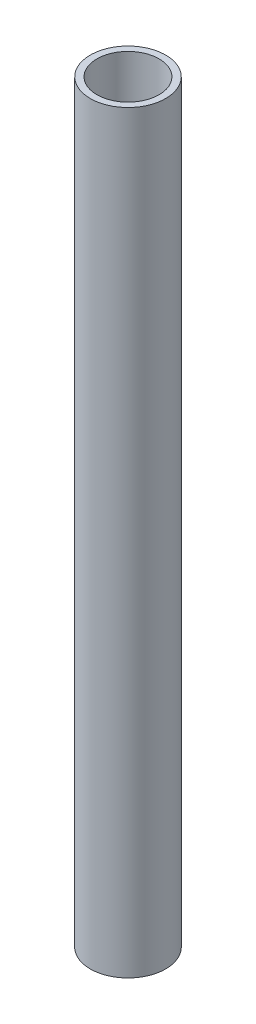
ISO-10303-21;
HEADER;
FILE_DESCRIPTION(('STEP AP214'),'2;1');
FILE_NAME('part.step','',(''),(''),'','','');
FILE_SCHEMA(('AUTOMOTIVE_DESIGN { 1 0 10303 214 1 1 1 1 }'));
ENDSEC;
DATA;
#1=APPLICATION_CONTEXT('core data for automotive mechanical design processes');
#2=APPLICATION_PROTOCOL_DEFINITION('international standard','automotive_design',2000,#1);
#3=PRODUCT_CONTEXT('',#1,'mechanical');
#4=PRODUCT('Part','Part','',(#3));
#5=PRODUCT_RELATED_PRODUCT_CATEGORY('part','',(#4));
#6=PRODUCT_DEFINITION_FORMATION('','',#4);
#7=PRODUCT_DEFINITION_CONTEXT('part definition',#1,'design');
#8=PRODUCT_DEFINITION('design','',#6,#7);
#9=PRODUCT_DEFINITION_SHAPE('','',#8);
#10=(LENGTH_UNIT() NAMED_UNIT(*) SI_UNIT(.MILLI.,.METRE.));
#11=(NAMED_UNIT(*) PLANE_ANGLE_UNIT() SI_UNIT($,.RADIAN.));
#12=(NAMED_UNIT(*) SI_UNIT($,.STERADIAN.) SOLID_ANGLE_UNIT());
#13=UNCERTAINTY_MEASURE_WITH_UNIT(LENGTH_MEASURE(1.E-05),#10,'distance_accuracy_value','');
#14=(GEOMETRIC_REPRESENTATION_CONTEXT(3) GLOBAL_UNCERTAINTY_ASSIGNED_CONTEXT((#13)) GLOBAL_UNIT_ASSIGNED_CONTEXT((#10,
#11,#12)) REPRESENTATION_CONTEXT('',''));
#15=CARTESIAN_POINT('',(0.,0.,0.));
#16=DIRECTION('',(0.,0.,1.));
#17=DIRECTION('',(1.,0.,0.));
#18=AXIS2_PLACEMENT_3D('',#15,#16,#17);
#19=CARTESIAN_POINT('',(0.,20.,0.));
#20=DIRECTION('',(0.,-1.,0.));
#21=DIRECTION('',(0.,0.,-1.));
#22=AXIS2_PLACEMENT_3D('',#19,#20,#21);
#23=CYLINDRICAL_SURFACE('',#22,2.);
#24=CARTESIAN_POINT('',(0.,20.,0.));
#25=DIRECTION('',(0.,1.,0.));
#26=DIRECTION('',(0.,0.,1.));
#27=AXIS2_PLACEMENT_3D('',#24,#25,#26);
#28=CIRCLE('',#27,2.);
#29=CARTESIAN_POINT('',(0.,20.,2.));
#30=VERTEX_POINT('',#29);
#31=EDGE_CURVE('E10',#30,#30,#28,.T.);
#32=ORIENTED_EDGE('',*,*,#31,.F.);
#33=EDGE_LOOP('',(#32));
#34=FACE_BOUND('',#33,.T.);
#35=CARTESIAN_POINT('',(0.,-20.,0.));
#36=DIRECTION('',(0.,1.,0.));
#37=DIRECTION('',(0.,0.,1.));
#38=AXIS2_PLACEMENT_3D('',#35,#36,#37);
#39=CIRCLE('',#38,2.);
#40=CARTESIAN_POINT('',(0.,-20.,2.));
#41=VERTEX_POINT('',#40);
#42=EDGE_CURVE('E36',#41,#41,#39,.T.);
#43=ORIENTED_EDGE('',*,*,#42,.T.);
#44=EDGE_LOOP('',(#43));
#45=FACE_BOUND('',#44,.T.);
#46=ADVANCED_FACE('F33',(#34,#45),#23,.T.);
#47=CARTESIAN_POINT('',(0.,20.,0.));
#48=DIRECTION('',(0.,1.,0.));
#49=DIRECTION('',(0.,0.,1.));
#50=AXIS2_PLACEMENT_3D('',#47,#48,#49);
#51=PLANE('',#50);
#52=CARTESIAN_POINT('',(0.,20.,0.));
#53=DIRECTION('',(0.,1.,0.));
#54=DIRECTION('',(0.,0.,1.));
#55=AXIS2_PLACEMENT_3D('',#52,#53,#54);
#56=CIRCLE('',#55,1.65);
#57=CARTESIAN_POINT('',(0.,20.,1.65));
#58=VERTEX_POINT('',#57);
#59=EDGE_CURVE('E43',#58,#58,#56,.T.);
#60=ORIENTED_EDGE('',*,*,#59,.F.);
#61=EDGE_LOOP('',(#60));
#62=FACE_BOUND('',#61,.T.);
#63=ORIENTED_EDGE('',*,*,#31,.T.);
#64=EDGE_LOOP('',(#63));
#65=FACE_BOUND('',#64,.T.);
#66=ADVANCED_FACE('F61',(#62,#65),#51,.T.);
#67=CARTESIAN_POINT('',(0.,-20.,0.));
#68=DIRECTION('',(0.,1.,0.));
#69=DIRECTION('',(0.,0.,1.));
#70=AXIS2_PLACEMENT_3D('',#67,#68,#69);
#71=PLANE('',#70);
#72=CARTESIAN_POINT('',(0.,-20.,0.));
#73=DIRECTION('',(0.,1.,0.));
#74=DIRECTION('',(0.,0.,1.));
#75=AXIS2_PLACEMENT_3D('',#72,#73,#74);
#76=CIRCLE('',#75,1.65);
#77=CARTESIAN_POINT('',(0.,-20.,1.65));
#78=VERTEX_POINT('',#77);
#79=EDGE_CURVE('E47',#78,#78,#76,.T.);
#80=ORIENTED_EDGE('',*,*,#79,.T.);
#81=EDGE_LOOP('',(#80));
#82=FACE_BOUND('',#81,.T.);
#83=ORIENTED_EDGE('',*,*,#42,.F.);
#84=EDGE_LOOP('',(#83));
#85=FACE_BOUND('',#84,.T.);
#86=ADVANCED_FACE('F51',(#82,#85),#71,.F.);
#87=CARTESIAN_POINT('',(0.,-20.,0.));
#88=DIRECTION('',(0.,1.,0.));
#89=DIRECTION('',(0.,0.,1.));
#90=AXIS2_PLACEMENT_3D('',#87,#88,#89);
#91=CYLINDRICAL_SURFACE('',#90,1.65);
#92=ORIENTED_EDGE('',*,*,#59,.T.);
#93=EDGE_LOOP('',(#92));
#94=FACE_BOUND('',#93,.T.);
#95=ORIENTED_EDGE('',*,*,#79,.F.);
#96=EDGE_LOOP('',(#95));
#97=FACE_BOUND('',#96,.T.);
#98=ADVANCED_FACE('F54',(#94,#97),#91,.F.);
#99=CLOSED_SHELL('',(#46,#66,#86,#98));
#100=MANIFOLD_SOLID_BREP('B2',#99);
#101=ADVANCED_BREP_SHAPE_REPRESENTATION('',(#18,#100),#14);
#102=SHAPE_DEFINITION_REPRESENTATION(#9,#101);
ENDSEC;
END-ISO-10303-21;
